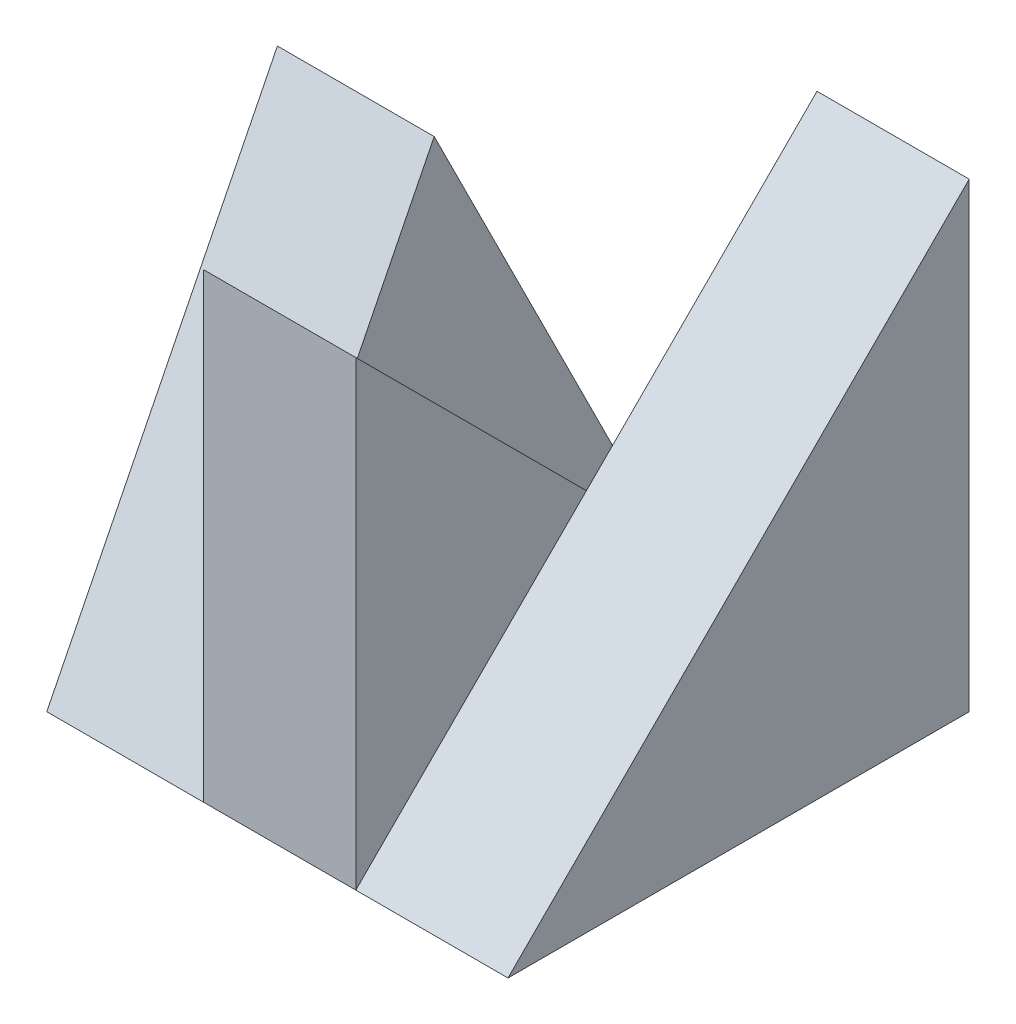
ISO-10303-21;
HEADER;
FILE_DESCRIPTION(('STEP AP214'),'2;1');
FILE_NAME('part.step','',(''),(''),'','','');
FILE_SCHEMA(('AUTOMOTIVE_DESIGN { 1 0 10303 214 1 1 1 1 }'));
ENDSEC;
DATA;
#1=APPLICATION_CONTEXT('core data for automotive mechanical design processes');
#2=APPLICATION_PROTOCOL_DEFINITION('international standard','automotive_design',2000,#1);
#3=PRODUCT_CONTEXT('',#1,'mechanical');
#4=PRODUCT('Part','Part','',(#3));
#5=PRODUCT_RELATED_PRODUCT_CATEGORY('part','',(#4));
#6=PRODUCT_DEFINITION_FORMATION('','',#4);
#7=PRODUCT_DEFINITION_CONTEXT('part definition',#1,'design');
#8=PRODUCT_DEFINITION('design','',#6,#7);
#9=PRODUCT_DEFINITION_SHAPE('','',#8);
#10=(LENGTH_UNIT() NAMED_UNIT(*) SI_UNIT(.MILLI.,.METRE.));
#11=(NAMED_UNIT(*) PLANE_ANGLE_UNIT() SI_UNIT($,.RADIAN.));
#12=(NAMED_UNIT(*) SI_UNIT($,.STERADIAN.) SOLID_ANGLE_UNIT());
#13=UNCERTAINTY_MEASURE_WITH_UNIT(LENGTH_MEASURE(1.E-05),#10,'distance_accuracy_value','');
#14=(GEOMETRIC_REPRESENTATION_CONTEXT(3) GLOBAL_UNCERTAINTY_ASSIGNED_CONTEXT((#13)) GLOBAL_UNIT_ASSIGNED_CONTEXT((#10,
#11,#12)) REPRESENTATION_CONTEXT('',''));
#15=CARTESIAN_POINT('',(0.,0.,0.));
#16=DIRECTION('',(0.,0.,1.));
#17=DIRECTION('',(1.,0.,0.));
#18=AXIS2_PLACEMENT_3D('',#15,#16,#17);
#19=CARTESIAN_POINT('',(0.,1.,0.));
#20=DIRECTION('',(-1.,0.,0.));
#21=DIRECTION('',(0.,0.,1.));
#22=AXIS2_PLACEMENT_3D('',#19,#20,#21);
#23=PLANE('',#22);
#24=DIRECTION('',(0.,0.,-1.));
#25=VECTOR('',#24,1.);
#26=CARTESIAN_POINT('',(0.,0.,0.));
#27=LINE('',#26,#25);
#28=CARTESIAN_POINT('',(0.,0.,0.));
#29=VERTEX_POINT('',#28);
#30=CARTESIAN_POINT('',(0.,0.,-1.));
#31=VERTEX_POINT('',#30);
#32=EDGE_CURVE('E149',#29,#31,#27,.T.);
#33=ORIENTED_EDGE('',*,*,#32,.F.);
#34=DIRECTION('',(0.,-0.894427190999916,0.447213595499958));
#35=VECTOR('',#34,1.);
#36=CARTESIAN_POINT('',(0.,1.,-0.5));
#37=LINE('',#36,#35);
#38=CARTESIAN_POINT('',(0.,1.,-0.5));
#39=VERTEX_POINT('',#38);
#40=EDGE_CURVE('E120',#39,#29,#37,.T.);
#41=ORIENTED_EDGE('',*,*,#40,.F.);
#42=DIRECTION('',(0.,0.894427190999916,0.447213595499958));
#43=VECTOR('',#42,1.);
#44=CARTESIAN_POINT('',(0.,0.,-1.));
#45=LINE('',#44,#43);
#46=EDGE_CURVE('E189',#31,#39,#45,.T.);
#47=ORIENTED_EDGE('',*,*,#46,.F.);
#48=EDGE_LOOP('',(#33,#41,#47));
#49=FACE_BOUND('',#48,.T.);
#50=ADVANCED_FACE('F39',(#49),#23,.T.);
#51=CARTESIAN_POINT('',(0.,1.,0.));
#52=DIRECTION('',(0.,0.,-1.));
#53=DIRECTION('',(-1.,0.,0.));
#54=AXIS2_PLACEMENT_3D('',#51,#52,#53);
#55=PLANE('',#54);
#56=DIRECTION('',(0.,-1.,0.));
#57=VECTOR('',#56,1.);
#58=CARTESIAN_POINT('',(0.34,1.,0.));
#59=LINE('',#58,#57);
#60=CARTESIAN_POINT('',(0.34,1.,0.));
#61=VERTEX_POINT('',#60);
#62=CARTESIAN_POINT('',(0.34,0.,0.));
#63=VERTEX_POINT('',#62);
#64=EDGE_CURVE('E109',#61,#63,#59,.T.);
#65=ORIENTED_EDGE('',*,*,#64,.T.);
#66=DIRECTION('',(1.,0.,0.));
#67=VECTOR('',#66,1.);
#68=CARTESIAN_POINT('',(0.,0.,0.));
#69=LINE('',#68,#67);
#70=CARTESIAN_POINT('',(0.67,0.,0.));
#71=VERTEX_POINT('',#70);
#72=EDGE_CURVE('E126',#63,#71,#69,.T.);
#73=ORIENTED_EDGE('',*,*,#72,.T.);
#74=DIRECTION('',(0.,-1.,0.));
#75=VECTOR('',#74,1.);
#76=CARTESIAN_POINT('',(0.67,1.,0.));
#77=LINE('',#76,#75);
#78=CARTESIAN_POINT('',(0.67,1.,0.));
#79=VERTEX_POINT('',#78);
#80=EDGE_CURVE('E152',#79,#71,#77,.T.);
#81=ORIENTED_EDGE('',*,*,#80,.F.);
#82=DIRECTION('',(1.,0.,0.));
#83=VECTOR('',#82,1.);
#84=CARTESIAN_POINT('',(0.34,1.,0.));
#85=LINE('',#84,#83);
#86=EDGE_CURVE('E62',#61,#79,#85,.T.);
#87=ORIENTED_EDGE('',*,*,#86,.F.);
#88=EDGE_LOOP('',(#65,#73,#81,#87));
#89=FACE_BOUND('',#88,.T.);
#90=ADVANCED_FACE('F128',(#89),#55,.F.);
#91=CARTESIAN_POINT('',(0.,1.,-1.));
#92=DIRECTION('',(0.,0.,-1.));
#93=DIRECTION('',(-1.,0.,0.));
#94=AXIS2_PLACEMENT_3D('',#91,#92,#93);
#95=PLANE('',#94);
#96=DIRECTION('',(1.,0.,0.));
#97=VECTOR('',#96,1.);
#98=CARTESIAN_POINT('',(0.,0.,-1.));
#99=LINE('',#98,#97);
#100=CARTESIAN_POINT('',(0.67,0.,-1.));
#101=VERTEX_POINT('',#100);
#102=CARTESIAN_POINT('',(1.,0.,-1.));
#103=VERTEX_POINT('',#102);
#104=EDGE_CURVE('E148',#101,#103,#99,.T.);
#105=ORIENTED_EDGE('',*,*,#104,.F.);
#106=DIRECTION('',(0.,1.,0.));
#107=VECTOR('',#106,1.);
#108=CARTESIAN_POINT('',(0.67,1.,-1.));
#109=LINE('',#108,#107);
#110=CARTESIAN_POINT('',(0.67,1.,-1.));
#111=VERTEX_POINT('',#110);
#112=EDGE_CURVE('E176',#101,#111,#109,.T.);
#113=ORIENTED_EDGE('',*,*,#112,.T.);
#114=DIRECTION('',(-1.,0.,0.));
#115=VECTOR('',#114,1.);
#116=CARTESIAN_POINT('',(4.4150635094611,1.,-1.));
#117=LINE('',#116,#115);
#118=CARTESIAN_POINT('',(1.,1.,-1.));
#119=VERTEX_POINT('',#118);
#120=EDGE_CURVE('E159',#119,#111,#117,.T.);
#121=ORIENTED_EDGE('',*,*,#120,.F.);
#122=DIRECTION('',(0.,-1.,0.));
#123=VECTOR('',#122,1.);
#124=CARTESIAN_POINT('',(1.,1.,-1.));
#125=LINE('',#124,#123);
#126=EDGE_CURVE('E11',#119,#103,#125,.T.);
#127=ORIENTED_EDGE('',*,*,#126,.T.);
#128=EDGE_LOOP('',(#105,#113,#121,#127));
#129=FACE_BOUND('',#128,.T.);
#130=ADVANCED_FACE('F208',(#129),#95,.T.);
#131=CARTESIAN_POINT('',(1.,1.,0.));
#132=DIRECTION('',(-1.,0.,0.));
#133=DIRECTION('',(0.,0.,1.));
#134=AXIS2_PLACEMENT_3D('',#131,#132,#133);
#135=PLANE('',#134);
#136=DIRECTION('',(0.,-0.707106781186548,0.707106781186548));
#137=VECTOR('',#136,1.);
#138=CARTESIAN_POINT('',(1.,0.,0.));
#139=LINE('',#138,#137);
#140=CARTESIAN_POINT('',(1.,0.,0.));
#141=VERTEX_POINT('',#140);
#142=EDGE_CURVE('E155',#119,#141,#139,.T.);
#143=ORIENTED_EDGE('',*,*,#142,.T.);
#144=DIRECTION('',(0.,0.,-1.));
#145=VECTOR('',#144,1.);
#146=CARTESIAN_POINT('',(1.,0.,0.));
#147=LINE('',#146,#145);
#148=EDGE_CURVE('E139',#141,#103,#147,.T.);
#149=ORIENTED_EDGE('',*,*,#148,.T.);
#150=ORIENTED_EDGE('',*,*,#126,.F.);
#151=EDGE_LOOP('',(#143,#149,#150));
#152=FACE_BOUND('',#151,.T.);
#153=ADVANCED_FACE('F222',(#152),#135,.F.);
#154=CARTESIAN_POINT('',(0.,0.,0.));
#155=DIRECTION('',(0.,-1.,0.));
#156=DIRECTION('',(0.,0.,-1.));
#157=AXIS2_PLACEMENT_3D('',#154,#155,#156);
#158=PLANE('',#157);
#159=ORIENTED_EDGE('',*,*,#32,.T.);
#160=CARTESIAN_POINT('',(0.34,0.,-1.));
#161=VERTEX_POINT('',#160);
#162=EDGE_CURVE('E142',#31,#161,#99,.T.);
#163=ORIENTED_EDGE('',*,*,#162,.T.);
#164=DIRECTION('',(1.,0.,0.));
#165=VECTOR('',#164,1.);
#166=CARTESIAN_POINT('',(0.34,0.,-1.));
#167=LINE('',#166,#165);
#168=EDGE_CURVE('E156',#161,#101,#167,.T.);
#169=ORIENTED_EDGE('',*,*,#168,.T.);
#170=ORIENTED_EDGE('',*,*,#104,.T.);
#171=ORIENTED_EDGE('',*,*,#148,.F.);
#172=DIRECTION('',(-1.,0.,0.));
#173=VECTOR('',#172,1.);
#174=CARTESIAN_POINT('',(4.4150635094611,0.,0.));
#175=LINE('',#174,#173);
#176=EDGE_CURVE('E136',#141,#71,#175,.T.);
#177=ORIENTED_EDGE('',*,*,#176,.T.);
#178=ORIENTED_EDGE('',*,*,#72,.F.);
#179=EDGE_CURVE('E47',#29,#63,#69,.T.);
#180=ORIENTED_EDGE('',*,*,#179,.F.);
#181=EDGE_LOOP('',(#159,#163,#169,#170,#171,#177,#178,#180));
#182=FACE_BOUND('',#181,.T.);
#183=ADVANCED_FACE('F134',(#182),#158,.T.);
#184=CARTESIAN_POINT('',(4.4150635094611,0.,0.));
#185=DIRECTION('',(0.,0.707106781186548,0.707106781186548));
#186=DIRECTION('',(0.,-0.707106781186548,0.707106781186548));
#187=AXIS2_PLACEMENT_3D('',#184,#185,#186);
#188=PLANE('',#187);
#189=ORIENTED_EDGE('',*,*,#142,.F.);
#190=ORIENTED_EDGE('',*,*,#120,.T.);
#191=DIRECTION('',(0.,-0.707106781186548,0.707106781186548));
#192=VECTOR('',#191,1.);
#193=CARTESIAN_POINT('',(0.67,0.,0.));
#194=LINE('',#193,#192);
#195=CARTESIAN_POINT('',(0.67,0.5,-0.5));
#196=VERTEX_POINT('',#195);
#197=EDGE_CURVE('E163',#111,#196,#194,.T.);
#198=ORIENTED_EDGE('',*,*,#197,.T.);
#199=EDGE_CURVE('E167',#196,#71,#194,.T.);
#200=ORIENTED_EDGE('',*,*,#199,.T.);
#201=ORIENTED_EDGE('',*,*,#176,.F.);
#202=EDGE_LOOP('',(#189,#190,#198,#200,#201));
#203=FACE_BOUND('',#202,.T.);
#204=ADVANCED_FACE('F231',(#203),#188,.T.);
#205=CARTESIAN_POINT('',(0.67,1.,0.));
#206=DIRECTION('',(-1.,0.,0.));
#207=DIRECTION('',(0.,0.,1.));
#208=AXIS2_PLACEMENT_3D('',#205,#206,#207);
#209=PLANE('',#208);
#210=ORIENTED_EDGE('',*,*,#199,.F.);
#211=DIRECTION('',(0.,-0.707106781186548,-0.707106781186548));
#212=VECTOR('',#211,1.);
#213=CARTESIAN_POINT('',(0.67,1.,0.));
#214=LINE('',#213,#212);
#215=EDGE_CURVE('E181',#79,#196,#214,.T.);
#216=ORIENTED_EDGE('',*,*,#215,.F.);
#217=ORIENTED_EDGE('',*,*,#80,.T.);
#218=EDGE_LOOP('',(#210,#216,#217));
#219=FACE_BOUND('',#218,.T.);
#220=ADVANCED_FACE('F246',(#219),#209,.F.);
#221=CARTESIAN_POINT('',(0.34,1.,0.));
#222=DIRECTION('',(0.,-0.707106781186548,0.707106781186548));
#223=DIRECTION('',(0.,-0.707106781186548,-0.707106781186548));
#224=AXIS2_PLACEMENT_3D('',#221,#222,#223);
#225=PLANE('',#224);
#226=ORIENTED_EDGE('',*,*,#215,.T.);
#227=EDGE_CURVE('E184',#196,#101,#214,.T.);
#228=ORIENTED_EDGE('',*,*,#227,.T.);
#229=ORIENTED_EDGE('',*,*,#168,.F.);
#230=DIRECTION('',(0.,-0.707106781186548,-0.707106781186548));
#231=VECTOR('',#230,1.);
#232=CARTESIAN_POINT('',(0.34,1.,0.));
#233=LINE('',#232,#231);
#234=CARTESIAN_POINT('',(0.34,0.666666666666667,-0.333333333333333));
#235=VERTEX_POINT('',#234);
#236=EDGE_CURVE('E180',#235,#161,#233,.T.);
#237=ORIENTED_EDGE('',*,*,#236,.F.);
#238=EDGE_CURVE('E110',#61,#235,#233,.T.);
#239=ORIENTED_EDGE('',*,*,#238,.F.);
#240=ORIENTED_EDGE('',*,*,#86,.T.);
#241=EDGE_LOOP('',(#226,#228,#229,#237,#239,#240));
#242=FACE_BOUND('',#241,.T.);
#243=ADVANCED_FACE('F201',(#242),#225,.F.);
#244=CARTESIAN_POINT('',(0.34,0.,0.));
#245=DIRECTION('',(-1.,0.,0.));
#246=DIRECTION('',(0.,0.,1.));
#247=AXIS2_PLACEMENT_3D('',#244,#245,#246);
#248=PLANE('',#247);
#249=DIRECTION('',(0.,0.894427190999916,0.447213595499958));
#250=VECTOR('',#249,1.);
#251=CARTESIAN_POINT('',(0.34,0.,-1.));
#252=LINE('',#251,#250);
#253=CARTESIAN_POINT('',(0.34,1.,-0.5));
#254=VERTEX_POINT('',#253);
#255=EDGE_CURVE('E115',#161,#254,#252,.T.);
#256=ORIENTED_EDGE('',*,*,#255,.T.);
#257=DIRECTION('',(0.,-0.894427190999916,0.447213595499958));
#258=VECTOR('',#257,1.);
#259=CARTESIAN_POINT('',(0.34,1.,-0.5));
#260=LINE('',#259,#258);
#261=EDGE_CURVE('E114',#254,#235,#260,.T.);
#262=ORIENTED_EDGE('',*,*,#261,.T.);
#263=ORIENTED_EDGE('',*,*,#236,.T.);
#264=EDGE_LOOP('',(#256,#262,#263));
#265=FACE_BOUND('',#264,.T.);
#266=ADVANCED_FACE('F238',(#265),#248,.F.);
#267=CARTESIAN_POINT('',(0.67,0.,0.));
#268=DIRECTION('',(-1.,0.,0.));
#269=DIRECTION('',(0.,0.,1.));
#270=AXIS2_PLACEMENT_3D('',#267,#268,#269);
#271=PLANE('',#270);
#272=ORIENTED_EDGE('',*,*,#112,.F.);
#273=ORIENTED_EDGE('',*,*,#227,.F.);
#274=ORIENTED_EDGE('',*,*,#197,.F.);
#275=EDGE_LOOP('',(#272,#273,#274));
#276=FACE_BOUND('',#275,.T.);
#277=ADVANCED_FACE('F206',(#276),#271,.T.);
#278=CARTESIAN_POINT('',(0.34,1.,0.));
#279=DIRECTION('',(-1.,0.,0.));
#280=DIRECTION('',(0.,0.,1.));
#281=AXIS2_PLACEMENT_3D('',#278,#279,#280);
#282=PLANE('',#281);
#283=ORIENTED_EDGE('',*,*,#64,.F.);
#284=ORIENTED_EDGE('',*,*,#238,.T.);
#285=EDGE_CURVE('E105',#235,#63,#260,.T.);
#286=ORIENTED_EDGE('',*,*,#285,.T.);
#287=EDGE_LOOP('',(#283,#284,#286));
#288=FACE_BOUND('',#287,.T.);
#289=ADVANCED_FACE('F107',(#288),#282,.T.);
#290=CARTESIAN_POINT('',(-3.0025635094611,1.,-0.5));
#291=DIRECTION('',(0.,0.447213595499958,0.894427190999916));
#292=DIRECTION('',(0.,-0.894427190999916,0.447213595499958));
#293=AXIS2_PLACEMENT_3D('',#290,#291,#292);
#294=PLANE('',#293);
#295=DIRECTION('',(1.,0.,0.));
#296=VECTOR('',#295,1.);
#297=CARTESIAN_POINT('',(-3.0025635094611,1.,-0.5));
#298=LINE('',#297,#296);
#299=EDGE_CURVE('E54',#39,#254,#298,.T.);
#300=ORIENTED_EDGE('',*,*,#299,.F.);
#301=ORIENTED_EDGE('',*,*,#40,.T.);
#302=ORIENTED_EDGE('',*,*,#179,.T.);
#303=ORIENTED_EDGE('',*,*,#285,.F.);
#304=ORIENTED_EDGE('',*,*,#261,.F.);
#305=EDGE_LOOP('',(#300,#301,#302,#303,#304));
#306=FACE_BOUND('',#305,.T.);
#307=ADVANCED_FACE('F118',(#306),#294,.T.);
#308=CARTESIAN_POINT('',(-3.0025635094611,0.,-1.));
#309=DIRECTION('',(0.,0.447213595499958,-0.894427190999916));
#310=DIRECTION('',(0.,0.894427190999916,0.447213595499958));
#311=AXIS2_PLACEMENT_3D('',#308,#309,#310);
#312=PLANE('',#311);
#313=ORIENTED_EDGE('',*,*,#162,.F.);
#314=ORIENTED_EDGE('',*,*,#46,.T.);
#315=ORIENTED_EDGE('',*,*,#299,.T.);
#316=ORIENTED_EDGE('',*,*,#255,.F.);
#317=EDGE_LOOP('',(#313,#314,#315,#316));
#318=FACE_BOUND('',#317,.T.);
#319=ADVANCED_FACE('F211',(#318),#312,.T.);
#320=CLOSED_SHELL('',(#50,#90,#130,#153,#183,#204,#220,#243,#266,#277,#289,#307,#319));
#321=MANIFOLD_SOLID_BREP('B2',#320);
#322=ADVANCED_BREP_SHAPE_REPRESENTATION('',(#18,#321),#14);
#323=SHAPE_DEFINITION_REPRESENTATION(#9,#322);
ENDSEC;
END-ISO-10303-21;
